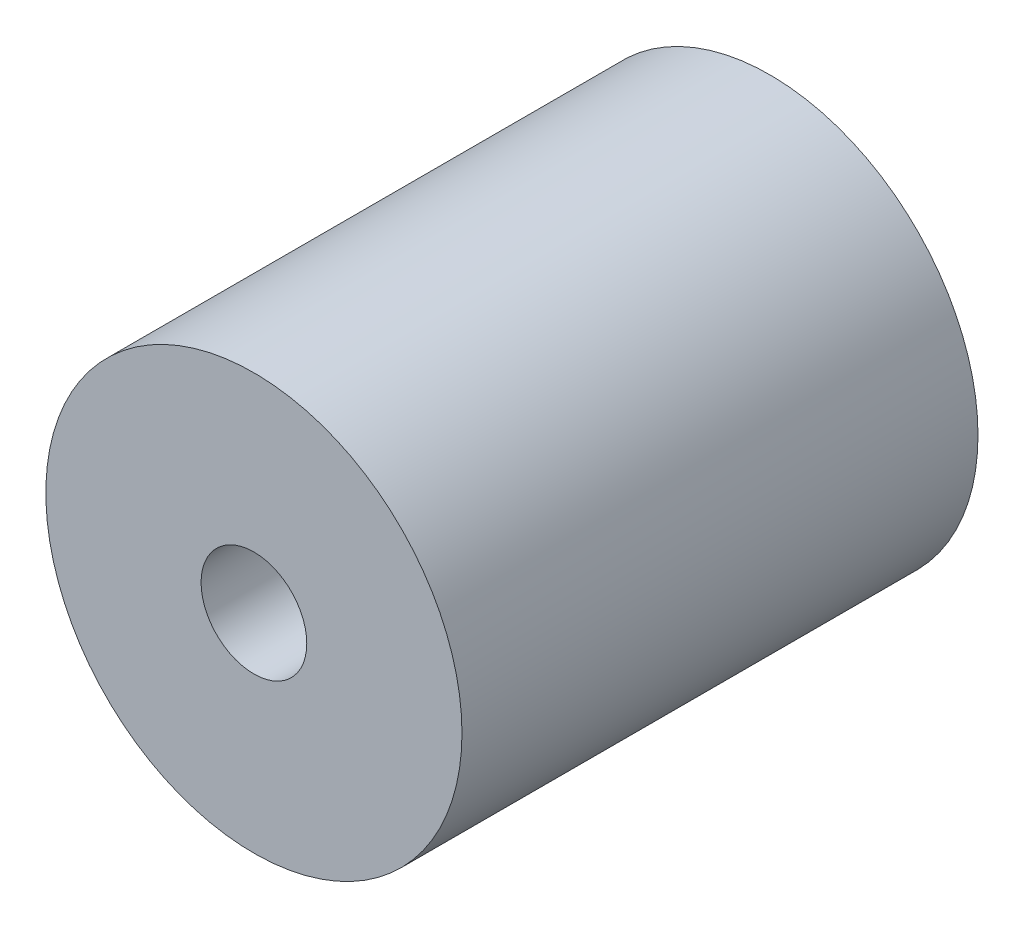
ISO-10303-21;
HEADER;
FILE_DESCRIPTION(('STEP AP214'),'2;1');
FILE_NAME('part.step','',(''),(''),'','','');
FILE_SCHEMA(('AUTOMOTIVE_DESIGN { 1 0 10303 214 1 1 1 1 }'));
ENDSEC;
DATA;
#1=APPLICATION_CONTEXT('core data for automotive mechanical design processes');
#2=APPLICATION_PROTOCOL_DEFINITION('international standard','automotive_design',2000,#1);
#3=PRODUCT_CONTEXT('',#1,'mechanical');
#4=PRODUCT('Part','Part','',(#3));
#5=PRODUCT_RELATED_PRODUCT_CATEGORY('part','',(#4));
#6=PRODUCT_DEFINITION_FORMATION('','',#4);
#7=PRODUCT_DEFINITION_CONTEXT('part definition',#1,'design');
#8=PRODUCT_DEFINITION('design','',#6,#7);
#9=PRODUCT_DEFINITION_SHAPE('','',#8);
#10=(LENGTH_UNIT() NAMED_UNIT(*) SI_UNIT(.MILLI.,.METRE.));
#11=(NAMED_UNIT(*) PLANE_ANGLE_UNIT() SI_UNIT($,.RADIAN.));
#12=(NAMED_UNIT(*) SI_UNIT($,.STERADIAN.) SOLID_ANGLE_UNIT());
#13=UNCERTAINTY_MEASURE_WITH_UNIT(LENGTH_MEASURE(1.E-05),#10,'distance_accuracy_value','');
#14=(GEOMETRIC_REPRESENTATION_CONTEXT(3) GLOBAL_UNCERTAINTY_ASSIGNED_CONTEXT((#13)) GLOBAL_UNIT_ASSIGNED_CONTEXT((#10,
#11,#12)) REPRESENTATION_CONTEXT('',''));
#15=CARTESIAN_POINT('',(0.,0.,0.));
#16=DIRECTION('',(0.,0.,1.));
#17=DIRECTION('',(1.,0.,0.));
#18=AXIS2_PLACEMENT_3D('',#15,#16,#17);
#19=CARTESIAN_POINT('',(0.,0.,31.));
#20=DIRECTION('',(0.,0.,-1.));
#21=DIRECTION('',(-1.,0.,0.));
#22=AXIS2_PLACEMENT_3D('',#19,#20,#21);
#23=CYLINDRICAL_SURFACE('',#22,3.175);
#24=CARTESIAN_POINT('',(0.,0.,31.));
#25=DIRECTION('',(0.,0.,1.));
#26=DIRECTION('',(1.,0.,0.));
#27=AXIS2_PLACEMENT_3D('',#24,#25,#26);
#28=CIRCLE('',#27,3.175);
#29=CARTESIAN_POINT('',(3.175,0.,31.));
#30=VERTEX_POINT('',#29);
#31=EDGE_CURVE('E43',#30,#30,#28,.T.);
#32=ORIENTED_EDGE('',*,*,#31,.T.);
#33=EDGE_LOOP('',(#32));
#34=FACE_BOUND('',#33,.T.);
#35=CARTESIAN_POINT('',(0.,0.,8.));
#36=DIRECTION('',(0.,0.,-1.));
#37=DIRECTION('',(-1.,0.,0.));
#38=AXIS2_PLACEMENT_3D('',#35,#36,#37);
#39=CIRCLE('',#38,3.175);
#40=CARTESIAN_POINT('',(-3.175,0.,8.));
#41=VERTEX_POINT('',#40);
#42=EDGE_CURVE('E34',#41,#41,#39,.T.);
#43=ORIENTED_EDGE('',*,*,#42,.T.);
#44=EDGE_LOOP('',(#43));
#45=FACE_BOUND('',#44,.T.);
#46=ADVANCED_FACE('F30',(#34,#45),#23,.F.);
#47=CARTESIAN_POINT('',(0.,0.,31.));
#48=DIRECTION('',(0.,0.,1.));
#49=DIRECTION('',(1.,0.,0.));
#50=AXIS2_PLACEMENT_3D('',#47,#48,#49);
#51=PLANE('',#50);
#52=CARTESIAN_POINT('',(0.,0.,31.));
#53=DIRECTION('',(0.,0.,1.));
#54=DIRECTION('',(1.,0.,0.));
#55=AXIS2_PLACEMENT_3D('',#52,#53,#54);
#56=CIRCLE('',#55,12.5);
#57=CARTESIAN_POINT('',(12.5,0.,31.));
#58=VERTEX_POINT('',#57);
#59=EDGE_CURVE('E10',#58,#58,#56,.T.);
#60=ORIENTED_EDGE('',*,*,#59,.T.);
#61=EDGE_LOOP('',(#60));
#62=FACE_BOUND('',#61,.T.);
#63=ORIENTED_EDGE('',*,*,#31,.F.);
#64=EDGE_LOOP('',(#63));
#65=FACE_BOUND('',#64,.T.);
#66=ADVANCED_FACE('F68',(#62,#65),#51,.T.);
#67=CARTESIAN_POINT('',(0.,0.,0.));
#68=DIRECTION('',(0.,0.,1.));
#69=DIRECTION('',(1.,0.,0.));
#70=AXIS2_PLACEMENT_3D('',#67,#68,#69);
#71=PLANE('',#70);
#72=CARTESIAN_POINT('',(0.,0.,0.));
#73=DIRECTION('',(0.,0.,-1.));
#74=DIRECTION('',(-1.,0.,0.));
#75=AXIS2_PLACEMENT_3D('',#72,#73,#74);
#76=CIRCLE('',#75,5.);
#77=CARTESIAN_POINT('',(-5.,0.,0.));
#78=VERTEX_POINT('',#77);
#79=EDGE_CURVE('E47',#78,#78,#76,.T.);
#80=ORIENTED_EDGE('',*,*,#79,.F.);
#81=EDGE_LOOP('',(#80));
#82=FACE_BOUND('',#81,.T.);
#83=CARTESIAN_POINT('',(0.,0.,0.));
#84=DIRECTION('',(0.,0.,1.));
#85=DIRECTION('',(1.,0.,0.));
#86=AXIS2_PLACEMENT_3D('',#83,#84,#85);
#87=CIRCLE('',#86,12.5);
#88=CARTESIAN_POINT('',(12.5,0.,0.));
#89=VERTEX_POINT('',#88);
#90=EDGE_CURVE('E38',#89,#89,#87,.T.);
#91=ORIENTED_EDGE('',*,*,#90,.F.);
#92=EDGE_LOOP('',(#91));
#93=FACE_BOUND('',#92,.T.);
#94=ADVANCED_FACE('F74',(#82,#93),#71,.F.);
#95=CARTESIAN_POINT('',(0.,0.,31.));
#96=DIRECTION('',(0.,0.,-1.));
#97=DIRECTION('',(-1.,0.,0.));
#98=AXIS2_PLACEMENT_3D('',#95,#96,#97);
#99=CYLINDRICAL_SURFACE('',#98,12.5);
#100=ORIENTED_EDGE('',*,*,#59,.F.);
#101=EDGE_LOOP('',(#100));
#102=FACE_BOUND('',#101,.T.);
#103=ORIENTED_EDGE('',*,*,#90,.T.);
#104=EDGE_LOOP('',(#103));
#105=FACE_BOUND('',#104,.T.);
#106=ADVANCED_FACE('F32',(#102,#105),#99,.T.);
#107=CARTESIAN_POINT('',(0.,0.,8.));
#108=DIRECTION('',(0.,0.,-1.));
#109=DIRECTION('',(-1.,0.,0.));
#110=AXIS2_PLACEMENT_3D('',#107,#108,#109);
#111=CYLINDRICAL_SURFACE('',#110,5.);
#112=CARTESIAN_POINT('',(0.,0.,8.));
#113=DIRECTION('',(0.,0.,-1.));
#114=DIRECTION('',(-1.,0.,0.));
#115=AXIS2_PLACEMENT_3D('',#112,#113,#114);
#116=CIRCLE('',#115,5.);
#117=CARTESIAN_POINT('',(-5.,0.,8.));
#118=VERTEX_POINT('',#117);
#119=EDGE_CURVE('E50',#118,#118,#116,.T.);
#120=ORIENTED_EDGE('',*,*,#119,.F.);
#121=EDGE_LOOP('',(#120));
#122=FACE_BOUND('',#121,.T.);
#123=ORIENTED_EDGE('',*,*,#79,.T.);
#124=EDGE_LOOP('',(#123));
#125=FACE_BOUND('',#124,.T.);
#126=ADVANCED_FACE('F60',(#122,#125),#111,.F.);
#127=CARTESIAN_POINT('',(0.,0.,8.));
#128=DIRECTION('',(0.,0.,-1.));
#129=DIRECTION('',(-1.,0.,0.));
#130=AXIS2_PLACEMENT_3D('',#127,#128,#129);
#131=PLANE('',#130);
#132=ORIENTED_EDGE('',*,*,#42,.F.);
#133=EDGE_LOOP('',(#132));
#134=FACE_BOUND('',#133,.T.);
#135=ORIENTED_EDGE('',*,*,#119,.T.);
#136=EDGE_LOOP('',(#135));
#137=FACE_BOUND('',#136,.T.);
#138=ADVANCED_FACE('F58',(#134,#137),#131,.T.);
#139=CLOSED_SHELL('',(#46,#66,#94,#106,#126,#138));
#140=MANIFOLD_SOLID_BREP('B2',#139);
#141=ADVANCED_BREP_SHAPE_REPRESENTATION('',(#18,#140),#14);
#142=SHAPE_DEFINITION_REPRESENTATION(#9,#141);
ENDSEC;
END-ISO-10303-21;
